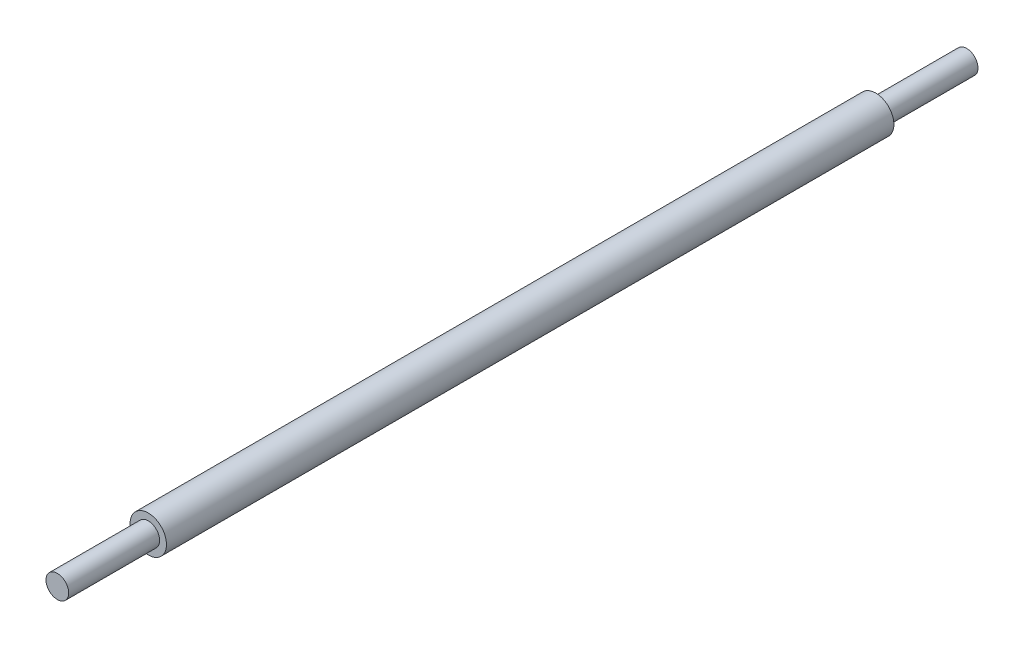
ISO-10303-21;
HEADER;
FILE_DESCRIPTION(('STEP AP214'),'2;1');
FILE_NAME('part.step','',(''),(''),'','','');
FILE_SCHEMA(('AUTOMOTIVE_DESIGN { 1 0 10303 214 1 1 1 1 }'));
ENDSEC;
DATA;
#1=APPLICATION_CONTEXT('core data for automotive mechanical design processes');
#2=APPLICATION_PROTOCOL_DEFINITION('international standard','automotive_design',2000,#1);
#3=PRODUCT_CONTEXT('',#1,'mechanical');
#4=PRODUCT('Part','Part','',(#3));
#5=PRODUCT_RELATED_PRODUCT_CATEGORY('part','',(#4));
#6=PRODUCT_DEFINITION_FORMATION('','',#4);
#7=PRODUCT_DEFINITION_CONTEXT('part definition',#1,'design');
#8=PRODUCT_DEFINITION('design','',#6,#7);
#9=PRODUCT_DEFINITION_SHAPE('','',#8);
#10=(LENGTH_UNIT() NAMED_UNIT(*) SI_UNIT(.MILLI.,.METRE.));
#11=(NAMED_UNIT(*) PLANE_ANGLE_UNIT() SI_UNIT($,.RADIAN.));
#12=(NAMED_UNIT(*) SI_UNIT($,.STERADIAN.) SOLID_ANGLE_UNIT());
#13=UNCERTAINTY_MEASURE_WITH_UNIT(LENGTH_MEASURE(1.E-05),#10,'distance_accuracy_value','');
#14=(GEOMETRIC_REPRESENTATION_CONTEXT(3) GLOBAL_UNCERTAINTY_ASSIGNED_CONTEXT((#13)) GLOBAL_UNIT_ASSIGNED_CONTEXT((#10,
#11,#12)) REPRESENTATION_CONTEXT('',''));
#15=CARTESIAN_POINT('',(0.,0.,0.));
#16=DIRECTION('',(0.,0.,1.));
#17=DIRECTION('',(1.,0.,0.));
#18=AXIS2_PLACEMENT_3D('',#15,#16,#17);
#19=CARTESIAN_POINT('',(0.,0.,67.056));
#20=DIRECTION('',(0.,0.,-1.));
#21=DIRECTION('',(-1.,0.,0.));
#22=AXIS2_PLACEMENT_3D('',#19,#20,#21);
#23=CYLINDRICAL_SURFACE('',#22,3.3528);
#24=CARTESIAN_POINT('',(0.,0.,67.056));
#25=DIRECTION('',(0.,0.,1.));
#26=DIRECTION('',(1.,0.,0.));
#27=AXIS2_PLACEMENT_3D('',#24,#25,#26);
#28=CIRCLE('',#27,3.3528);
#29=CARTESIAN_POINT('',(3.3528,0.,67.056));
#30=VERTEX_POINT('',#29);
#31=EDGE_CURVE('E44',#30,#30,#28,.T.);
#32=ORIENTED_EDGE('',*,*,#31,.F.);
#33=EDGE_LOOP('',(#32));
#34=FACE_BOUND('',#33,.T.);
#35=CARTESIAN_POINT('',(0.,0.,-67.056));
#36=DIRECTION('',(0.,0.,1.));
#37=DIRECTION('',(1.,0.,0.));
#38=AXIS2_PLACEMENT_3D('',#35,#36,#37);
#39=CIRCLE('',#38,3.3528);
#40=CARTESIAN_POINT('',(3.3528,0.,-67.056));
#41=VERTEX_POINT('',#40);
#42=EDGE_CURVE('E39',#41,#41,#39,.T.);
#43=ORIENTED_EDGE('',*,*,#42,.T.);
#44=EDGE_LOOP('',(#43));
#45=FACE_BOUND('',#44,.T.);
#46=ADVANCED_FACE('F36',(#34,#45),#23,.T.);
#47=CARTESIAN_POINT('',(0.,0.,67.056));
#48=DIRECTION('',(0.,0.,1.));
#49=DIRECTION('',(1.,0.,0.));
#50=AXIS2_PLACEMENT_3D('',#47,#48,#49);
#51=PLANE('',#50);
#52=CARTESIAN_POINT('',(0.,0.,67.056));
#53=DIRECTION('',(0.,0.,1.));
#54=DIRECTION('',(1.,0.,0.));
#55=AXIS2_PLACEMENT_3D('',#52,#53,#54);
#56=CIRCLE('',#55,2.0955);
#57=CARTESIAN_POINT('',(2.0955,0.,67.056));
#58=VERTEX_POINT('',#57);
#59=EDGE_CURVE('E10',#58,#58,#56,.T.);
#60=ORIENTED_EDGE('',*,*,#59,.F.);
#61=EDGE_LOOP('',(#60));
#62=FACE_BOUND('',#61,.T.);
#63=ORIENTED_EDGE('',*,*,#31,.T.);
#64=EDGE_LOOP('',(#63));
#65=FACE_BOUND('',#64,.T.);
#66=ADVANCED_FACE('F76',(#62,#65),#51,.T.);
#67=CARTESIAN_POINT('',(0.,0.,-67.056));
#68=DIRECTION('',(0.,0.,1.));
#69=DIRECTION('',(1.,0.,0.));
#70=AXIS2_PLACEMENT_3D('',#67,#68,#69);
#71=PLANE('',#70);
#72=CARTESIAN_POINT('',(0.,0.,-67.056));
#73=DIRECTION('',(0.,0.,1.));
#74=DIRECTION('',(1.,0.,0.));
#75=AXIS2_PLACEMENT_3D('',#72,#73,#74);
#76=CIRCLE('',#75,2.0955);
#77=CARTESIAN_POINT('',(2.0955,0.,-67.056));
#78=VERTEX_POINT('',#77);
#79=EDGE_CURVE('E56',#78,#78,#76,.T.);
#80=ORIENTED_EDGE('',*,*,#79,.T.);
#81=EDGE_LOOP('',(#80));
#82=FACE_BOUND('',#81,.T.);
#83=ORIENTED_EDGE('',*,*,#42,.F.);
#84=EDGE_LOOP('',(#83));
#85=FACE_BOUND('',#84,.T.);
#86=ADVANCED_FACE('F81',(#82,#85),#71,.F.);
#87=CARTESIAN_POINT('',(0.,0.,83.82));
#88=DIRECTION('',(0.,0.,-1.));
#89=DIRECTION('',(-1.,0.,0.));
#90=AXIS2_PLACEMENT_3D('',#87,#88,#89);
#91=CYLINDRICAL_SURFACE('',#90,2.0955);
#92=CARTESIAN_POINT('',(0.,0.,83.82));
#93=DIRECTION('',(0.,0.,1.));
#94=DIRECTION('',(1.,0.,0.));
#95=AXIS2_PLACEMENT_3D('',#92,#93,#94);
#96=CIRCLE('',#95,2.0955);
#97=CARTESIAN_POINT('',(2.0955,0.,83.82));
#98=VERTEX_POINT('',#97);
#99=EDGE_CURVE('E51',#98,#98,#96,.T.);
#100=ORIENTED_EDGE('',*,*,#99,.F.);
#101=EDGE_LOOP('',(#100));
#102=FACE_BOUND('',#101,.T.);
#103=ORIENTED_EDGE('',*,*,#59,.T.);
#104=EDGE_LOOP('',(#103));
#105=FACE_BOUND('',#104,.T.);
#106=ADVANCED_FACE('F91',(#102,#105),#91,.T.);
#107=CARTESIAN_POINT('',(0.,0.,83.82));
#108=DIRECTION('',(0.,0.,1.));
#109=DIRECTION('',(1.,0.,0.));
#110=AXIS2_PLACEMENT_3D('',#107,#108,#109);
#111=PLANE('',#110);
#112=ORIENTED_EDGE('',*,*,#99,.T.);
#113=EDGE_LOOP('',(#112));
#114=FACE_BOUND('',#113,.T.);
#115=ADVANCED_FACE('F73',(#114),#111,.T.);
#116=CARTESIAN_POINT('',(0.,0.,-83.82));
#117=DIRECTION('',(0.,0.,1.));
#118=DIRECTION('',(1.,0.,0.));
#119=AXIS2_PLACEMENT_3D('',#116,#117,#118);
#120=CYLINDRICAL_SURFACE('',#119,2.0955);
#121=CARTESIAN_POINT('',(0.,0.,-83.82));
#122=DIRECTION('',(0.,0.,1.));
#123=DIRECTION('',(1.,0.,0.));
#124=AXIS2_PLACEMENT_3D('',#121,#122,#123);
#125=CIRCLE('',#124,2.0955);
#126=CARTESIAN_POINT('',(2.0955,0.,-83.82));
#127=VERTEX_POINT('',#126);
#128=EDGE_CURVE('E55',#127,#127,#125,.T.);
#129=ORIENTED_EDGE('',*,*,#128,.T.);
#130=EDGE_LOOP('',(#129));
#131=FACE_BOUND('',#130,.T.);
#132=ORIENTED_EDGE('',*,*,#79,.F.);
#133=EDGE_LOOP('',(#132));
#134=FACE_BOUND('',#133,.T.);
#135=ADVANCED_FACE('F64',(#131,#134),#120,.T.);
#136=CARTESIAN_POINT('',(0.,0.,-83.82));
#137=DIRECTION('',(0.,0.,-1.));
#138=DIRECTION('',(1.,0.,0.));
#139=AXIS2_PLACEMENT_3D('',#136,#137,#138);
#140=PLANE('',#139);
#141=ORIENTED_EDGE('',*,*,#128,.F.);
#142=EDGE_LOOP('',(#141));
#143=FACE_BOUND('',#142,.T.);
#144=ADVANCED_FACE('F67',(#143),#140,.T.);
#145=CLOSED_SHELL('',(#46,#66,#86,#106,#115,#135,#144));
#146=MANIFOLD_SOLID_BREP('B2',#145);
#147=ADVANCED_BREP_SHAPE_REPRESENTATION('',(#18,#146),#14);
#148=SHAPE_DEFINITION_REPRESENTATION(#9,#147);
ENDSEC;
END-ISO-10303-21;
